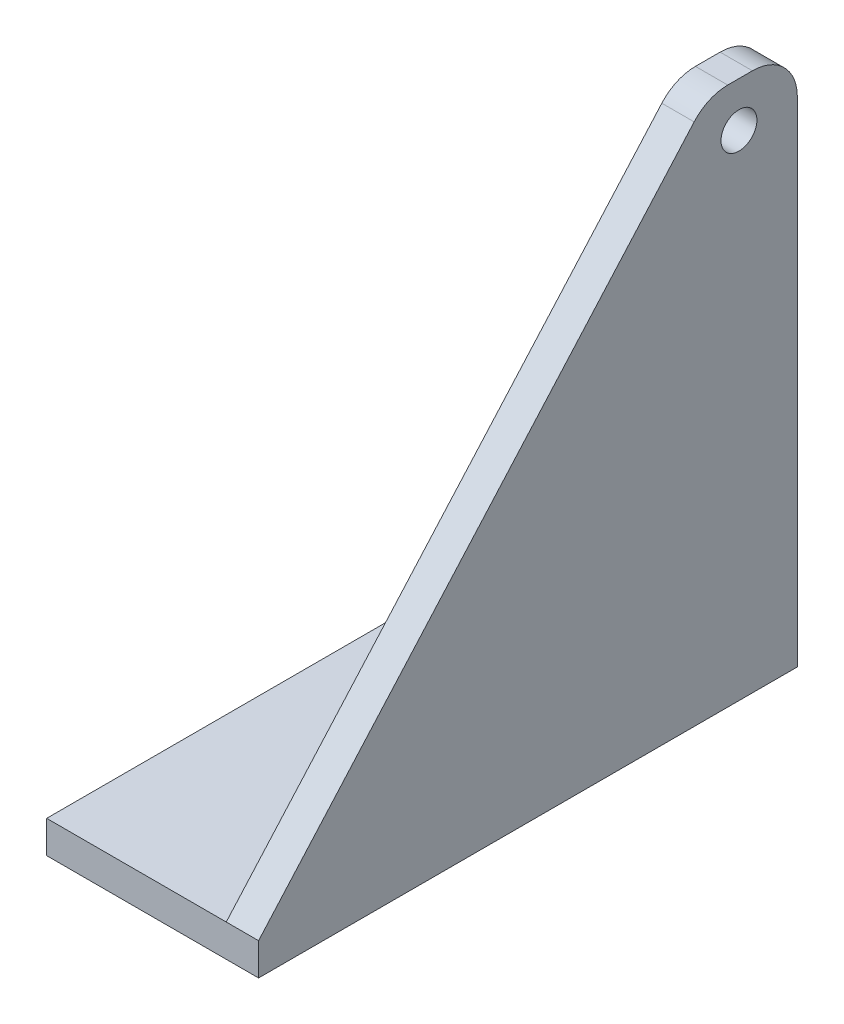
ISO-10303-21;
HEADER;
FILE_DESCRIPTION(('STEP AP214'),'2;1');
FILE_NAME('part.step','',(''),(''),'','','');
FILE_SCHEMA(('AUTOMOTIVE_DESIGN { 1 0 10303 214 1 1 1 1 }'));
ENDSEC;
DATA;
#1=APPLICATION_CONTEXT('core data for automotive mechanical design processes');
#2=APPLICATION_PROTOCOL_DEFINITION('international standard','automotive_design',2000,#1);
#3=PRODUCT_CONTEXT('',#1,'mechanical');
#4=PRODUCT('Part','Part','',(#3));
#5=PRODUCT_RELATED_PRODUCT_CATEGORY('part','',(#4));
#6=PRODUCT_DEFINITION_FORMATION('','',#4);
#7=PRODUCT_DEFINITION_CONTEXT('part definition',#1,'design');
#8=PRODUCT_DEFINITION('design','',#6,#7);
#9=PRODUCT_DEFINITION_SHAPE('','',#8);
#10=(LENGTH_UNIT() NAMED_UNIT(*) SI_UNIT(.MILLI.,.METRE.));
#11=(NAMED_UNIT(*) PLANE_ANGLE_UNIT() SI_UNIT($,.RADIAN.));
#12=(NAMED_UNIT(*) SI_UNIT($,.STERADIAN.) SOLID_ANGLE_UNIT());
#13=UNCERTAINTY_MEASURE_WITH_UNIT(LENGTH_MEASURE(1.E-05),#10,'distance_accuracy_value','');
#14=(GEOMETRIC_REPRESENTATION_CONTEXT(3) GLOBAL_UNCERTAINTY_ASSIGNED_CONTEXT((#13)) GLOBAL_UNIT_ASSIGNED_CONTEXT((#10,
#11,#12)) REPRESENTATION_CONTEXT('',''));
#15=CARTESIAN_POINT('',(0.,0.,0.));
#16=DIRECTION('',(0.,0.,1.));
#17=DIRECTION('',(1.,0.,0.));
#18=AXIS2_PLACEMENT_3D('',#15,#16,#17);
#19=CARTESIAN_POINT('',(0.,0.,76.2));
#20=DIRECTION('',(1.,0.,0.));
#21=DIRECTION('',(0.,0.,-1.));
#22=AXIS2_PLACEMENT_3D('',#19,#20,#21);
#23=PLANE('',#22);
#24=DIRECTION('',(0.,-1.,0.));
#25=VECTOR('',#24,1.);
#26=CARTESIAN_POINT('',(0.,0.,0.));
#27=LINE('',#26,#25);
#28=CARTESIAN_POINT('',(0.,4.572,0.));
#29=VERTEX_POINT('',#28);
#30=CARTESIAN_POINT('',(0.,0.,0.));
#31=VERTEX_POINT('',#30);
#32=EDGE_CURVE('E116',#29,#31,#27,.T.);
#33=ORIENTED_EDGE('',*,*,#32,.T.);
#34=DIRECTION('',(0.,0.,-1.));
#35=VECTOR('',#34,1.);
#36=CARTESIAN_POINT('',(0.,0.,76.2));
#37=LINE('',#36,#35);
#38=CARTESIAN_POINT('',(0.,0.,76.2));
#39=VERTEX_POINT('',#38);
#40=EDGE_CURVE('E112',#39,#31,#37,.T.);
#41=ORIENTED_EDGE('',*,*,#40,.F.);
#42=DIRECTION('',(0.,-1.,0.));
#43=VECTOR('',#42,1.);
#44=CARTESIAN_POINT('',(0.,0.,76.2));
#45=LINE('',#44,#43);
#46=CARTESIAN_POINT('',(0.,4.572,76.2));
#47=VERTEX_POINT('',#46);
#48=EDGE_CURVE('E145',#47,#39,#45,.T.);
#49=ORIENTED_EDGE('',*,*,#48,.F.);
#50=DIRECTION('',(0.,0.,-1.));
#51=VECTOR('',#50,1.);
#52=CARTESIAN_POINT('',(0.,4.572,76.2));
#53=LINE('',#52,#51);
#54=EDGE_CURVE('E152',#47,#29,#53,.T.);
#55=ORIENTED_EDGE('',*,*,#54,.T.);
#56=EDGE_LOOP('',(#33,#41,#49,#55));
#57=FACE_BOUND('',#56,.T.);
#58=ADVANCED_FACE('F35',(#57),#23,.F.);
#59=CARTESIAN_POINT('',(0.,0.,76.2));
#60=DIRECTION('',(0.,1.,0.));
#61=DIRECTION('',(0.,0.,1.));
#62=AXIS2_PLACEMENT_3D('',#59,#60,#61);
#63=PLANE('',#62);
#64=DIRECTION('',(1.,0.,0.));
#65=VECTOR('',#64,1.);
#66=CARTESIAN_POINT('',(0.,0.,0.));
#67=LINE('',#66,#65);
#68=CARTESIAN_POINT('',(29.972,0.,0.));
#69=VERTEX_POINT('',#68);
#70=EDGE_CURVE('E107',#31,#69,#67,.T.);
#71=ORIENTED_EDGE('',*,*,#70,.T.);
#72=DIRECTION('',(0.,0.,-1.));
#73=VECTOR('',#72,1.);
#74=CARTESIAN_POINT('',(29.972,0.,76.2));
#75=LINE('',#74,#73);
#76=CARTESIAN_POINT('',(29.972,0.,76.2));
#77=VERTEX_POINT('',#76);
#78=EDGE_CURVE('E110',#77,#69,#75,.T.);
#79=ORIENTED_EDGE('',*,*,#78,.F.);
#80=DIRECTION('',(1.,0.,0.));
#81=VECTOR('',#80,1.);
#82=CARTESIAN_POINT('',(0.,0.,76.2));
#83=LINE('',#82,#81);
#84=EDGE_CURVE('E148',#39,#77,#83,.T.);
#85=ORIENTED_EDGE('',*,*,#84,.F.);
#86=ORIENTED_EDGE('',*,*,#40,.T.);
#87=EDGE_LOOP('',(#71,#79,#85,#86));
#88=FACE_BOUND('',#87,.T.);
#89=ADVANCED_FACE('F108',(#88),#63,.F.);
#90=CARTESIAN_POINT('',(0.,4.572,76.2));
#91=DIRECTION('',(0.,-1.,0.));
#92=DIRECTION('',(0.,0.,-1.));
#93=AXIS2_PLACEMENT_3D('',#90,#91,#92);
#94=PLANE('',#93);
#95=DIRECTION('',(-1.,0.,0.));
#96=VECTOR('',#95,1.);
#97=CARTESIAN_POINT('',(0.,4.572,0.));
#98=LINE('',#97,#96);
#99=CARTESIAN_POINT('',(25.4,4.572,0.));
#100=VERTEX_POINT('',#99);
#101=EDGE_CURVE('E115',#100,#29,#98,.T.);
#102=ORIENTED_EDGE('',*,*,#101,.T.);
#103=ORIENTED_EDGE('',*,*,#54,.F.);
#104=DIRECTION('',(-1.,0.,0.));
#105=VECTOR('',#104,1.);
#106=CARTESIAN_POINT('',(0.,4.572,76.2));
#107=LINE('',#106,#105);
#108=CARTESIAN_POINT('',(25.4,4.572,76.2));
#109=VERTEX_POINT('',#108);
#110=EDGE_CURVE('E150',#109,#47,#107,.T.);
#111=ORIENTED_EDGE('',*,*,#110,.F.);
#112=DIRECTION('',(0.,0.,-1.));
#113=VECTOR('',#112,1.);
#114=CARTESIAN_POINT('',(25.4,4.572,76.2));
#115=LINE('',#114,#113);
#116=EDGE_CURVE('E157',#109,#100,#115,.T.);
#117=ORIENTED_EDGE('',*,*,#116,.T.);
#118=EDGE_LOOP('',(#102,#103,#111,#117));
#119=FACE_BOUND('',#118,.T.);
#120=ADVANCED_FACE('F186',(#119),#94,.F.);
#121=CARTESIAN_POINT('',(0.,0.,76.2));
#122=DIRECTION('',(0.,0.,-1.));
#123=DIRECTION('',(-1.,0.,0.));
#124=AXIS2_PLACEMENT_3D('',#121,#122,#123);
#125=PLANE('',#124);
#126=ORIENTED_EDGE('',*,*,#48,.T.);
#127=ORIENTED_EDGE('',*,*,#84,.T.);
#128=DIRECTION('',(0.,-1.,0.));
#129=VECTOR('',#128,1.);
#130=CARTESIAN_POINT('',(29.972,0.,76.2));
#131=LINE('',#130,#129);
#132=CARTESIAN_POINT('',(29.972,4.572,76.2));
#133=VERTEX_POINT('',#132);
#134=EDGE_CURVE('E126',#133,#77,#131,.T.);
#135=ORIENTED_EDGE('',*,*,#134,.F.);
#136=DIRECTION('',(-1.,0.,0.));
#137=VECTOR('',#136,1.);
#138=CARTESIAN_POINT('',(29.972,4.572,76.2));
#139=LINE('',#138,#137);
#140=EDGE_CURVE('E138',#133,#109,#139,.T.);
#141=ORIENTED_EDGE('',*,*,#140,.T.);
#142=ORIENTED_EDGE('',*,*,#110,.T.);
#143=EDGE_LOOP('',(#126,#127,#135,#141,#142));
#144=FACE_BOUND('',#143,.T.);
#145=ADVANCED_FACE('F191',(#144),#125,.F.);
#146=CARTESIAN_POINT('',(0.,0.,0.));
#147=DIRECTION('',(0.,0.,-1.));
#148=DIRECTION('',(-1.,0.,0.));
#149=AXIS2_PLACEMENT_3D('',#146,#147,#148);
#150=PLANE('',#149);
#151=DIRECTION('',(0.,1.,0.));
#152=VECTOR('',#151,1.);
#153=CARTESIAN_POINT('',(25.4,0.,0.));
#154=LINE('',#153,#152);
#155=CARTESIAN_POINT('',(25.4,69.85,0.));
#156=VERTEX_POINT('',#155);
#157=EDGE_CURVE('E139',#100,#156,#154,.T.);
#158=ORIENTED_EDGE('',*,*,#157,.T.);
#159=DIRECTION('',(-1.,0.,0.));
#160=VECTOR('',#159,1.);
#161=CARTESIAN_POINT('',(29.972,69.85,0.));
#162=LINE('',#161,#160);
#163=CARTESIAN_POINT('',(29.972,69.85,0.));
#164=VERTEX_POINT('',#163);
#165=EDGE_CURVE('E59',#156,#164,#162,.F.);
#166=ORIENTED_EDGE('',*,*,#165,.T.);
#167=DIRECTION('',(0.,1.,0.));
#168=VECTOR('',#167,1.);
#169=CARTESIAN_POINT('',(29.972,0.,0.));
#170=LINE('',#169,#168);
#171=EDGE_CURVE('E118',#69,#164,#170,.T.);
#172=ORIENTED_EDGE('',*,*,#171,.F.);
#173=ORIENTED_EDGE('',*,*,#70,.F.);
#174=ORIENTED_EDGE('',*,*,#32,.F.);
#175=ORIENTED_EDGE('',*,*,#101,.F.);
#176=EDGE_LOOP('',(#158,#166,#172,#173,#174,#175));
#177=FACE_BOUND('',#176,.T.);
#178=ADVANCED_FACE('F119',(#177),#150,.T.);
#179=CARTESIAN_POINT('',(29.972,76.2,0.));
#180=DIRECTION('',(0.,-1.,0.));
#181=DIRECTION('',(0.,0.,-1.));
#182=AXIS2_PLACEMENT_3D('',#179,#180,#181);
#183=PLANE('',#182);
#184=DIRECTION('',(0.,0.,1.));
#185=VECTOR('',#184,1.);
#186=CARTESIAN_POINT('',(29.972,76.2,0.));
#187=LINE('',#186,#185);
#188=CARTESIAN_POINT('',(29.972,76.2,6.35));
#189=VERTEX_POINT('',#188);
#190=CARTESIAN_POINT('',(29.972,76.2,9.84338456453749));
#191=VERTEX_POINT('',#190);
#192=EDGE_CURVE('E121',#189,#191,#187,.T.);
#193=ORIENTED_EDGE('',*,*,#192,.F.);
#194=DIRECTION('',(-1.,0.,0.));
#195=VECTOR('',#194,1.);
#196=CARTESIAN_POINT('',(25.4,76.2,6.35));
#197=LINE('',#196,#195);
#198=CARTESIAN_POINT('',(25.4,76.2,6.35));
#199=VERTEX_POINT('',#198);
#200=EDGE_CURVE('E163',#189,#199,#197,.T.);
#201=ORIENTED_EDGE('',*,*,#200,.T.);
#202=DIRECTION('',(0.,0.,1.));
#203=VECTOR('',#202,1.);
#204=CARTESIAN_POINT('',(25.4,76.2,0.));
#205=LINE('',#204,#203);
#206=CARTESIAN_POINT('',(25.4,76.2,9.84338456453749));
#207=VERTEX_POINT('',#206);
#208=EDGE_CURVE('E129',#199,#207,#205,.T.);
#209=ORIENTED_EDGE('',*,*,#208,.T.);
#210=DIRECTION('',(-1.,0.,0.));
#211=VECTOR('',#210,1.);
#212=CARTESIAN_POINT('',(29.972,76.2,9.84338456453749));
#213=LINE('',#212,#211);
#214=EDGE_CURVE('E161',#207,#191,#213,.F.);
#215=ORIENTED_EDGE('',*,*,#214,.T.);
#216=EDGE_LOOP('',(#193,#201,#209,#215));
#217=FACE_BOUND('',#216,.T.);
#218=ADVANCED_FACE('F176',(#217),#183,.F.);
#219=CARTESIAN_POINT('',(29.972,76.2,12.7));
#220=DIRECTION('',(0.,-0.66337505804731,-0.748287065477366));
#221=DIRECTION('',(0.,0.748287065477366,-0.66337505804731));
#222=AXIS2_PLACEMENT_3D('',#219,#220,#221);
#223=PLANE('',#222);
#224=DIRECTION('',(0.,-0.748287065477366,0.66337505804731));
#225=VECTOR('',#224,1.);
#226=CARTESIAN_POINT('',(29.972,76.2,12.7));
#227=LINE('',#226,#225);
#228=CARTESIAN_POINT('',(29.972,74.0624316186004,14.5950074303188));
#229=VERTEX_POINT('',#228);
#230=EDGE_CURVE('E135',#229,#133,#227,.T.);
#231=ORIENTED_EDGE('',*,*,#230,.F.);
#232=DIRECTION('',(-1.,0.,0.));
#233=VECTOR('',#232,1.);
#234=CARTESIAN_POINT('',(29.972,74.0624316186004,14.5950074303188));
#235=LINE('',#234,#233);
#236=CARTESIAN_POINT('',(25.4,74.0624316186004,14.5950074303188));
#237=VERTEX_POINT('',#236);
#238=EDGE_CURVE('E11',#229,#237,#235,.T.);
#239=ORIENTED_EDGE('',*,*,#238,.T.);
#240=DIRECTION('',(0.,-0.748287065477366,0.66337505804731));
#241=VECTOR('',#240,1.);
#242=CARTESIAN_POINT('',(25.4,76.2,12.7));
#243=LINE('',#242,#241);
#244=EDGE_CURVE('E127',#237,#109,#243,.T.);
#245=ORIENTED_EDGE('',*,*,#244,.T.);
#246=ORIENTED_EDGE('',*,*,#140,.F.);
#247=EDGE_LOOP('',(#231,#239,#245,#246));
#248=FACE_BOUND('',#247,.T.);
#249=ADVANCED_FACE('F194',(#248),#223,.F.);
#250=CARTESIAN_POINT('',(29.972,0.,0.));
#251=DIRECTION('',(1.,0.,0.));
#252=DIRECTION('',(0.,0.,-1.));
#253=AXIS2_PLACEMENT_3D('',#250,#251,#252);
#254=PLANE('',#253);
#255=CARTESIAN_POINT('',(29.972,69.85,8.255));
#256=DIRECTION('',(1.,0.,0.));
#257=DIRECTION('',(0.,0.,-1.));
#258=AXIS2_PLACEMENT_3D('',#255,#256,#257);
#259=CIRCLE('',#258,2.54);
#260=CARTESIAN_POINT('',(29.972,69.85,5.71500000000001));
#261=VERTEX_POINT('',#260);
#262=EDGE_CURVE('E132',#261,#261,#259,.T.);
#263=ORIENTED_EDGE('',*,*,#262,.F.);
#264=EDGE_LOOP('',(#263));
#265=FACE_BOUND('',#264,.T.);
#266=ORIENTED_EDGE('',*,*,#171,.T.);
#267=CARTESIAN_POINT('',(29.972,69.85,6.35));
#268=DIRECTION('',(1.,0.,0.));
#269=DIRECTION('',(0.,0.,-1.));
#270=AXIS2_PLACEMENT_3D('',#267,#268,#269);
#271=CIRCLE('',#270,6.35);
#272=EDGE_CURVE('E44',#164,#189,#271,.T.);
#273=ORIENTED_EDGE('',*,*,#272,.T.);
#274=ORIENTED_EDGE('',*,*,#192,.T.);
#275=CARTESIAN_POINT('',(29.972,69.85,9.84338456453749));
#276=DIRECTION('',(1.,0.,0.));
#277=DIRECTION('',(0.,0.,-1.));
#278=AXIS2_PLACEMENT_3D('',#275,#276,#277);
#279=CIRCLE('',#278,6.35);
#280=EDGE_CURVE('E51',#191,#229,#279,.T.);
#281=ORIENTED_EDGE('',*,*,#280,.T.);
#282=ORIENTED_EDGE('',*,*,#230,.T.);
#283=ORIENTED_EDGE('',*,*,#134,.T.);
#284=ORIENTED_EDGE('',*,*,#78,.T.);
#285=EDGE_LOOP('',(#266,#273,#274,#281,#282,#283,#284));
#286=FACE_BOUND('',#285,.T.);
#287=ADVANCED_FACE('F124',(#265,#286),#254,.T.);
#288=CARTESIAN_POINT('',(25.4,0.,0.));
#289=DIRECTION('',(1.,0.,0.));
#290=DIRECTION('',(0.,0.,-1.));
#291=AXIS2_PLACEMENT_3D('',#288,#289,#290);
#292=PLANE('',#291);
#293=CARTESIAN_POINT('',(25.4,69.85,8.255));
#294=DIRECTION('',(1.,0.,0.));
#295=DIRECTION('',(0.,0.,-1.));
#296=AXIS2_PLACEMENT_3D('',#293,#294,#295);
#297=CIRCLE('',#296,2.54);
#298=CARTESIAN_POINT('',(25.4,69.85,5.71500000000001));
#299=VERTEX_POINT('',#298);
#300=EDGE_CURVE('E39',#299,#299,#297,.T.);
#301=ORIENTED_EDGE('',*,*,#300,.T.);
#302=EDGE_LOOP('',(#301));
#303=FACE_BOUND('',#302,.T.);
#304=ORIENTED_EDGE('',*,*,#208,.F.);
#305=CARTESIAN_POINT('',(25.4,69.85,6.35));
#306=DIRECTION('',(1.,0.,0.));
#307=DIRECTION('',(0.,0.,-1.));
#308=AXIS2_PLACEMENT_3D('',#305,#306,#307);
#309=CIRCLE('',#308,6.35);
#310=EDGE_CURVE('E168',#199,#156,#309,.F.);
#311=ORIENTED_EDGE('',*,*,#310,.T.);
#312=ORIENTED_EDGE('',*,*,#157,.F.);
#313=ORIENTED_EDGE('',*,*,#116,.F.);
#314=ORIENTED_EDGE('',*,*,#244,.F.);
#315=CARTESIAN_POINT('',(25.4,69.85,9.84338456453749));
#316=DIRECTION('',(1.,0.,0.));
#317=DIRECTION('',(0.,0.,-1.));
#318=AXIS2_PLACEMENT_3D('',#315,#316,#317);
#319=CIRCLE('',#318,6.35);
#320=EDGE_CURVE('E166',#237,#207,#319,.F.);
#321=ORIENTED_EDGE('',*,*,#320,.T.);
#322=EDGE_LOOP('',(#304,#311,#312,#313,#314,#321));
#323=FACE_BOUND('',#322,.T.);
#324=ADVANCED_FACE('F181',(#303,#323),#292,.F.);
#325=CARTESIAN_POINT('',(29.972,69.85,6.35));
#326=DIRECTION('',(1.,0.,0.));
#327=DIRECTION('',(0.,0.,-1.));
#328=AXIS2_PLACEMENT_3D('',#325,#326,#327);
#329=CYLINDRICAL_SURFACE('',#328,6.35);
#330=ORIENTED_EDGE('',*,*,#272,.F.);
#331=ORIENTED_EDGE('',*,*,#165,.F.);
#332=ORIENTED_EDGE('',*,*,#310,.F.);
#333=ORIENTED_EDGE('',*,*,#200,.F.);
#334=EDGE_LOOP('',(#330,#331,#332,#333));
#335=FACE_BOUND('',#334,.T.);
#336=ADVANCED_FACE('F179',(#335),#329,.T.);
#337=CARTESIAN_POINT('',(29.972,69.85,9.84338456453749));
#338=DIRECTION('',(-1.,0.,0.));
#339=DIRECTION('',(0.,0.,1.));
#340=AXIS2_PLACEMENT_3D('',#337,#338,#339);
#341=CYLINDRICAL_SURFACE('',#340,6.35);
#342=ORIENTED_EDGE('',*,*,#280,.F.);
#343=ORIENTED_EDGE('',*,*,#214,.F.);
#344=ORIENTED_EDGE('',*,*,#320,.F.);
#345=ORIENTED_EDGE('',*,*,#238,.F.);
#346=EDGE_LOOP('',(#342,#343,#344,#345));
#347=FACE_BOUND('',#346,.T.);
#348=ADVANCED_FACE('F37',(#347),#341,.T.);
#349=CARTESIAN_POINT('',(0.,69.85,8.255));
#350=DIRECTION('',(1.,0.,0.));
#351=DIRECTION('',(0.,0.,-1.));
#352=AXIS2_PLACEMENT_3D('',#349,#350,#351);
#353=CYLINDRICAL_SURFACE('',#352,2.54);
#354=ORIENTED_EDGE('',*,*,#262,.T.);
#355=EDGE_LOOP('',(#354));
#356=FACE_BOUND('',#355,.T.);
#357=ORIENTED_EDGE('',*,*,#300,.F.);
#358=EDGE_LOOP('',(#357));
#359=FACE_BOUND('',#358,.T.);
#360=ADVANCED_FACE('F199',(#356,#359),#353,.F.);
#361=CLOSED_SHELL('',(#58,#89,#120,#145,#178,#218,#249,#287,#324,#336,#348,#360));
#362=MANIFOLD_SOLID_BREP('B2',#361);
#363=ADVANCED_BREP_SHAPE_REPRESENTATION('',(#18,#362),#14);
#364=SHAPE_DEFINITION_REPRESENTATION(#9,#363);
ENDSEC;
END-ISO-10303-21;
